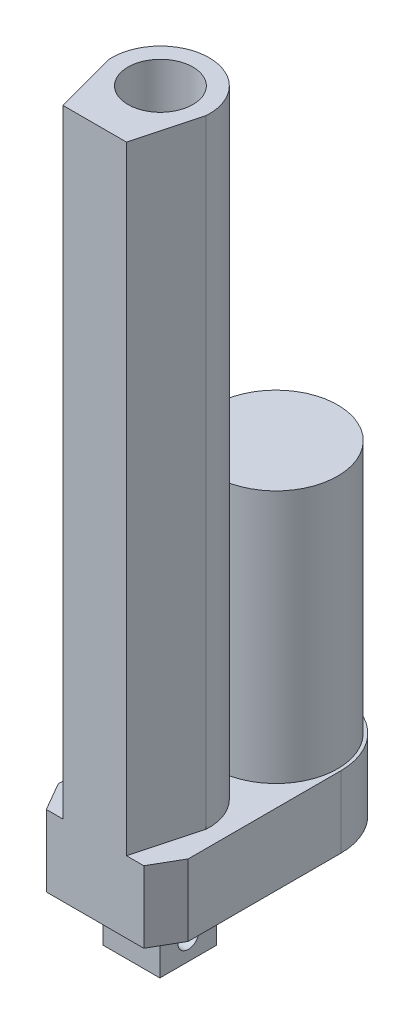
ISO-10303-21;
HEADER;
FILE_DESCRIPTION(('STEP AP214'),'2;1');
FILE_NAME('part.step','',(''),(''),'','','');
FILE_SCHEMA(('AUTOMOTIVE_DESIGN { 1 0 10303 214 1 1 1 1 }'));
ENDSEC;
DATA;
#1=APPLICATION_CONTEXT('core data for automotive mechanical design processes');
#2=APPLICATION_PROTOCOL_DEFINITION('international standard','automotive_design',2000,#1);
#3=PRODUCT_CONTEXT('',#1,'mechanical');
#4=PRODUCT('Part','Part','',(#3));
#5=PRODUCT_RELATED_PRODUCT_CATEGORY('part','',(#4));
#6=PRODUCT_DEFINITION_FORMATION('','',#4);
#7=PRODUCT_DEFINITION_CONTEXT('part definition',#1,'design');
#8=PRODUCT_DEFINITION('design','',#6,#7);
#9=PRODUCT_DEFINITION_SHAPE('','',#8);
#10=(LENGTH_UNIT() NAMED_UNIT(*) SI_UNIT(.MILLI.,.METRE.));
#11=(NAMED_UNIT(*) PLANE_ANGLE_UNIT() SI_UNIT($,.RADIAN.));
#12=(NAMED_UNIT(*) SI_UNIT($,.STERADIAN.) SOLID_ANGLE_UNIT());
#13=UNCERTAINTY_MEASURE_WITH_UNIT(LENGTH_MEASURE(1.E-05),#10,'distance_accuracy_value','');
#14=(GEOMETRIC_REPRESENTATION_CONTEXT(3) GLOBAL_UNCERTAINTY_ASSIGNED_CONTEXT((#13)) GLOBAL_UNIT_ASSIGNED_CONTEXT((#10,
#11,#12)) REPRESENTATION_CONTEXT('',''));
#15=CARTESIAN_POINT('',(0.,0.,0.));
#16=DIRECTION('',(0.,0.,1.));
#17=DIRECTION('',(1.,0.,0.));
#18=AXIS2_PLACEMENT_3D('',#15,#16,#17);
#19=CARTESIAN_POINT('',(1.39693295528514,212.2,29.2101852421836));
#20=DIRECTION('',(0.,-1.,0.));
#21=DIRECTION('',(0.,0.,-1.));
#22=AXIS2_PLACEMENT_3D('',#19,#20,#21);
#23=CYLINDRICAL_SURFACE('',#22,10.);
#24=CARTESIAN_POINT('',(1.39693295528514,212.2,29.2101852421836));
#25=DIRECTION('',(0.,1.,0.));
#26=DIRECTION('',(0.,0.,1.));
#27=AXIS2_PLACEMENT_3D('',#24,#25,#26);
#28=CIRCLE('',#27,10.);
#29=CARTESIAN_POINT('',(1.39693295528514,212.2,39.2101852421836));
#30=VERTEX_POINT('',#29);
#31=EDGE_CURVE('E549',#30,#30,#28,.T.);
#32=ORIENTED_EDGE('',*,*,#31,.T.);
#33=EDGE_LOOP('',(#32));
#34=FACE_BOUND('',#33,.T.);
#35=CARTESIAN_POINT('',(1.39693295528514,22.,29.2101852421836));
#36=DIRECTION('',(0.,-1.,0.));
#37=DIRECTION('',(0.,0.,-1.));
#38=AXIS2_PLACEMENT_3D('',#35,#36,#37);
#39=CIRCLE('',#38,10.);
#40=CARTESIAN_POINT('',(1.39693295528514,22.,19.2101852421836));
#41=VERTEX_POINT('',#40);
#42=EDGE_CURVE('E583',#41,#41,#39,.T.);
#43=ORIENTED_EDGE('',*,*,#42,.T.);
#44=EDGE_LOOP('',(#43));
#45=FACE_BOUND('',#44,.T.);
#46=ADVANCED_FACE('F137',(#34,#45),#23,.F.);
#47=CARTESIAN_POINT('',(-7.10029052433689,-16.5,20.8825637620671));
#48=DIRECTION('',(-1.,0.,0.));
#49=DIRECTION('',(0.,0.,1.));
#50=AXIS2_PLACEMENT_3D('',#47,#48,#49);
#51=PLANE('',#50);
#52=CARTESIAN_POINT('',(-7.10029052433689,-10.,29.6325637620671));
#53=DIRECTION('',(-1.,0.,0.));
#54=DIRECTION('',(0.,0.,1.));
#55=AXIS2_PLACEMENT_3D('',#52,#53,#54);
#56=CIRCLE('',#55,3.25);
#57=CARTESIAN_POINT('',(-7.10029052433689,-10.,32.8825637620671));
#58=VERTEX_POINT('',#57);
#59=EDGE_CURVE('E496',#58,#58,#56,.T.);
#60=ORIENTED_EDGE('',*,*,#59,.F.);
#61=EDGE_LOOP('',(#60));
#62=FACE_BOUND('',#61,.T.);
#63=DIRECTION('',(0.,0.,1.));
#64=VECTOR('',#63,1.);
#65=CARTESIAN_POINT('',(-7.10029052433689,0.,20.8825637620671));
#66=LINE('',#65,#64);
#67=CARTESIAN_POINT('',(-7.10029052433689,0.,20.8825637620671));
#68=VERTEX_POINT('',#67);
#69=CARTESIAN_POINT('',(-7.10029052433689,0.,38.3825637620671));
#70=VERTEX_POINT('',#69);
#71=EDGE_CURVE('E265',#68,#70,#66,.T.);
#72=ORIENTED_EDGE('',*,*,#71,.F.);
#73=DIRECTION('',(0.,1.,0.));
#74=VECTOR('',#73,1.);
#75=CARTESIAN_POINT('',(-7.10029052433689,-16.5,20.8825637620671));
#76=LINE('',#75,#74);
#77=CARTESIAN_POINT('',(-7.10029052433689,-16.5,20.8825637620671));
#78=VERTEX_POINT('',#77);
#79=EDGE_CURVE('E12',#78,#68,#76,.T.);
#80=ORIENTED_EDGE('',*,*,#79,.F.);
#81=DIRECTION('',(0.,0.,1.));
#82=VECTOR('',#81,1.);
#83=CARTESIAN_POINT('',(-7.10029052433689,-16.5,20.8825637620671));
#84=LINE('',#83,#82);
#85=CARTESIAN_POINT('',(-7.10029052433689,-16.5,38.3825637620671));
#86=VERTEX_POINT('',#85);
#87=EDGE_CURVE('E274',#78,#86,#84,.T.);
#88=ORIENTED_EDGE('',*,*,#87,.T.);
#89=DIRECTION('',(0.,1.,0.));
#90=VECTOR('',#89,1.);
#91=CARTESIAN_POINT('',(-7.10029052433689,-16.5,38.3825637620671));
#92=LINE('',#91,#90);
#93=EDGE_CURVE('E141',#86,#70,#92,.T.);
#94=ORIENTED_EDGE('',*,*,#93,.T.);
#95=EDGE_LOOP('',(#72,#80,#88,#94));
#96=FACE_BOUND('',#95,.T.);
#97=ADVANCED_FACE('F139',(#62,#96),#51,.T.);
#98=CARTESIAN_POINT('',(-7.10029052433689,-16.5,20.8825637620671));
#99=DIRECTION('',(0.,0.,1.));
#100=DIRECTION('',(1.,0.,0.));
#101=AXIS2_PLACEMENT_3D('',#98,#99,#100);
#102=PLANE('',#101);
#103=DIRECTION('',(1.,0.,0.));
#104=VECTOR('',#103,1.);
#105=CARTESIAN_POINT('',(-7.10029052433689,0.,20.8825637620671));
#106=LINE('',#105,#104);
#107=CARTESIAN_POINT('',(10.3997094756631,0.,20.8825637620671));
#108=VERTEX_POINT('',#107);
#109=EDGE_CURVE('E277',#68,#108,#106,.T.);
#110=ORIENTED_EDGE('',*,*,#109,.T.);
#111=DIRECTION('',(0.,1.,0.));
#112=VECTOR('',#111,1.);
#113=CARTESIAN_POINT('',(10.3997094756631,-16.5,20.8825637620671));
#114=LINE('',#113,#112);
#115=CARTESIAN_POINT('',(10.3997094756631,-16.5,20.8825637620671));
#116=VERTEX_POINT('',#115);
#117=EDGE_CURVE('E146',#116,#108,#114,.T.);
#118=ORIENTED_EDGE('',*,*,#117,.F.);
#119=DIRECTION('',(1.,0.,0.));
#120=VECTOR('',#119,1.);
#121=CARTESIAN_POINT('',(-7.10029052433689,-16.5,20.8825637620671));
#122=LINE('',#121,#120);
#123=EDGE_CURVE('E159',#78,#116,#122,.T.);
#124=ORIENTED_EDGE('',*,*,#123,.F.);
#125=ORIENTED_EDGE('',*,*,#79,.T.);
#126=EDGE_LOOP('',(#110,#118,#124,#125));
#127=FACE_BOUND('',#126,.T.);
#128=ADVANCED_FACE('F302',(#127),#102,.F.);
#129=CARTESIAN_POINT('',(10.3997094756631,-16.5,20.8825637620671));
#130=DIRECTION('',(-1.,0.,0.));
#131=DIRECTION('',(0.,0.,1.));
#132=AXIS2_PLACEMENT_3D('',#129,#130,#131);
#133=PLANE('',#132);
#134=CARTESIAN_POINT('',(10.3997094756631,-10.,29.6325637620671));
#135=DIRECTION('',(1.,0.,0.));
#136=DIRECTION('',(0.,0.,-1.));
#137=AXIS2_PLACEMENT_3D('',#134,#135,#136);
#138=CIRCLE('',#137,3.25);
#139=CARTESIAN_POINT('',(10.3997094756631,-10.,26.3825637620671));
#140=VERTEX_POINT('',#139);
#141=EDGE_CURVE('E502',#140,#140,#138,.T.);
#142=ORIENTED_EDGE('',*,*,#141,.F.);
#143=EDGE_LOOP('',(#142));
#144=FACE_BOUND('',#143,.T.);
#145=DIRECTION('',(0.,0.,1.));
#146=VECTOR('',#145,1.);
#147=CARTESIAN_POINT('',(10.3997094756631,0.,20.8825637620671));
#148=LINE('',#147,#146);
#149=CARTESIAN_POINT('',(10.3997094756631,0.,38.3825637620671));
#150=VERTEX_POINT('',#149);
#151=EDGE_CURVE('E285',#108,#150,#148,.T.);
#152=ORIENTED_EDGE('',*,*,#151,.T.);
#153=DIRECTION('',(0.,1.,0.));
#154=VECTOR('',#153,1.);
#155=CARTESIAN_POINT('',(10.3997094756631,-16.5,38.3825637620671));
#156=LINE('',#155,#154);
#157=CARTESIAN_POINT('',(10.3997094756631,-16.5,38.3825637620671));
#158=VERTEX_POINT('',#157);
#159=EDGE_CURVE('E289',#158,#150,#156,.T.);
#160=ORIENTED_EDGE('',*,*,#159,.F.);
#161=DIRECTION('',(0.,0.,1.));
#162=VECTOR('',#161,1.);
#163=CARTESIAN_POINT('',(10.3997094756631,-16.5,20.8825637620671));
#164=LINE('',#163,#162);
#165=EDGE_CURVE('E280',#116,#158,#164,.T.);
#166=ORIENTED_EDGE('',*,*,#165,.F.);
#167=ORIENTED_EDGE('',*,*,#117,.T.);
#168=EDGE_LOOP('',(#152,#160,#166,#167));
#169=FACE_BOUND('',#168,.T.);
#170=ADVANCED_FACE('F306',(#144,#169),#133,.F.);
#171=CARTESIAN_POINT('',(-7.10029052433689,-16.5,38.3825637620671));
#172=DIRECTION('',(0.,0.,1.));
#173=DIRECTION('',(1.,0.,0.));
#174=AXIS2_PLACEMENT_3D('',#171,#172,#173);
#175=PLANE('',#174);
#176=DIRECTION('',(1.,0.,0.));
#177=VECTOR('',#176,1.);
#178=CARTESIAN_POINT('',(-7.10029052433689,0.,38.3825637620671));
#179=LINE('',#178,#177);
#180=EDGE_CURVE('E268',#70,#150,#179,.T.);
#181=ORIENTED_EDGE('',*,*,#180,.F.);
#182=ORIENTED_EDGE('',*,*,#93,.F.);
#183=DIRECTION('',(1.,0.,0.));
#184=VECTOR('',#183,1.);
#185=CARTESIAN_POINT('',(-7.10029052433689,-16.5,38.3825637620671));
#186=LINE('',#185,#184);
#187=EDGE_CURVE('E276',#86,#158,#186,.T.);
#188=ORIENTED_EDGE('',*,*,#187,.T.);
#189=ORIENTED_EDGE('',*,*,#159,.T.);
#190=EDGE_LOOP('',(#181,#182,#188,#189));
#191=FACE_BOUND('',#190,.T.);
#192=ADVANCED_FACE('F296',(#191),#175,.T.);
#193=CARTESIAN_POINT('',(0.,-16.5,0.));
#194=DIRECTION('',(0.,1.,0.));
#195=DIRECTION('',(0.,0.,1.));
#196=AXIS2_PLACEMENT_3D('',#193,#194,#195);
#197=PLANE('',#196);
#198=ORIENTED_EDGE('',*,*,#87,.F.);
#199=ORIENTED_EDGE('',*,*,#123,.T.);
#200=ORIENTED_EDGE('',*,*,#165,.T.);
#201=ORIENTED_EDGE('',*,*,#187,.F.);
#202=EDGE_LOOP('',(#198,#199,#200,#201));
#203=FACE_BOUND('',#202,.T.);
#204=ADVANCED_FACE('F304',(#203),#197,.F.);
#205=CARTESIAN_POINT('',(0.,0.,0.));
#206=DIRECTION('',(0.,1.,0.));
#207=DIRECTION('',(0.,0.,1.));
#208=AXIS2_PLACEMENT_3D('',#205,#206,#207);
#209=PLANE('',#208);
#210=ORIENTED_EDGE('',*,*,#71,.T.);
#211=ORIENTED_EDGE('',*,*,#180,.T.);
#212=ORIENTED_EDGE('',*,*,#151,.F.);
#213=ORIENTED_EDGE('',*,*,#109,.F.);
#214=EDGE_LOOP('',(#210,#211,#212,#213));
#215=FACE_BOUND('',#214,.T.);
#216=DIRECTION('',(-0.499999999999998,0.,0.86602540378444));
#217=VECTOR('',#216,1.);
#218=CARTESIAN_POINT('',(33.7854353399476,0.,19.5060301882074));
#219=LINE('',#218,#217);
#220=CARTESIAN_POINT('',(21.5081005950559,0.,40.7709977478905));
#221=VERTEX_POINT('',#220);
#222=CARTESIAN_POINT('',(16.508100595056,0.,49.4312517857349));
#223=VERTEX_POINT('',#222);
#224=EDGE_CURVE('E495',#221,#223,#219,.T.);
#225=ORIENTED_EDGE('',*,*,#224,.T.);
#226=DIRECTION('',(-1.,0.,0.));
#227=VECTOR('',#226,1.);
#228=CARTESIAN_POINT('',(0.,0.,49.4312517857349));
#229=LINE('',#228,#227);
#230=CARTESIAN_POINT('',(-13.4918994049441,0.,49.4312517857349));
#231=VERTEX_POINT('',#230);
#232=EDGE_CURVE('E548',#223,#231,#229,.T.);
#233=ORIENTED_EDGE('',*,*,#232,.T.);
#234=DIRECTION('',(0.5,0.,0.866025403784439));
#235=VECTOR('',#234,1.);
#236=CARTESIAN_POINT('',(-31.5232844473637,0.,18.1999767614266));
#237=LINE('',#236,#235);
#238=CARTESIAN_POINT('',(-18.4918994049441,0.,40.7709977478905));
#239=VERTEX_POINT('',#238);
#240=EDGE_CURVE('E251',#239,#231,#237,.T.);
#241=ORIENTED_EDGE('',*,*,#240,.F.);
#242=DIRECTION('',(0.,0.,1.));
#243=VECTOR('',#242,1.);
#244=CARTESIAN_POINT('',(-18.4918994049441,0.,0.));
#245=LINE('',#244,#243);
#246=CARTESIAN_POINT('',(-18.4918994049441,0.,-6.22900225210949));
#247=VERTEX_POINT('',#246);
#248=EDGE_CURVE('E530',#247,#239,#245,.T.);
#249=ORIENTED_EDGE('',*,*,#248,.F.);
#250=CARTESIAN_POINT('',(1.50810059505592,0.,-6.2290022521095));
#251=DIRECTION('',(0.,1.,0.));
#252=DIRECTION('',(0.,0.,1.));
#253=AXIS2_PLACEMENT_3D('',#250,#251,#252);
#254=CIRCLE('',#253,20.);
#255=CARTESIAN_POINT('',(21.5081005950559,0.,-6.2290022521095));
#256=VERTEX_POINT('',#255);
#257=EDGE_CURVE('E527',#247,#256,#254,.F.);
#258=ORIENTED_EDGE('',*,*,#257,.T.);
#259=DIRECTION('',(0.,0.,-1.));
#260=VECTOR('',#259,1.);
#261=CARTESIAN_POINT('',(21.5081005950559,0.,0.));
#262=LINE('',#261,#260);
#263=EDGE_CURVE('E499',#221,#256,#262,.T.);
#264=ORIENTED_EDGE('',*,*,#263,.F.);
#265=EDGE_LOOP('',(#225,#233,#241,#249,#258,#264));
#266=FACE_BOUND('',#265,.T.);
#267=ADVANCED_FACE('F299',(#215,#266),#209,.F.);
#268=CARTESIAN_POINT('',(22.7960664699933,212.2,6.10818760124099));
#269=DIRECTION('',(-0.965925826289067,0.,-0.258819045102525));
#270=DIRECTION('',(-0.258819045102525,0.,0.965925826289067));
#271=AXIS2_PLACEMENT_3D('',#268,#269,#270);
#272=PLANE('',#271);
#273=DIRECTION('',(0.,-1.,0.));
#274=VECTOR('',#273,1.);
#275=CARTESIAN_POINT('',(11.1876864081163,212.2,49.4312517857349));
#276=LINE('',#275,#274);
#277=CARTESIAN_POINT('',(11.1876864081163,212.2,49.4312517857349));
#278=VERTEX_POINT('',#277);
#279=CARTESIAN_POINT('',(11.1876864081163,22.,49.4312517857349));
#280=VERTEX_POINT('',#279);
#281=EDGE_CURVE('E259',#278,#280,#276,.T.);
#282=ORIENTED_EDGE('',*,*,#281,.T.);
#283=DIRECTION('',(0.258819045102525,0.,-0.965925826289067));
#284=VECTOR('',#283,1.);
#285=CARTESIAN_POINT('',(22.7960664699933,22.,6.10818760124099));
#286=LINE('',#285,#284);
#287=CARTESIAN_POINT('',(16.3713739329175,22.,30.0854665726159));
#288=VERTEX_POINT('',#287);
#289=EDGE_CURVE('E244',#280,#288,#286,.T.);
#290=ORIENTED_EDGE('',*,*,#289,.T.);
#291=DIRECTION('',(0.,-1.,0.));
#292=VECTOR('',#291,1.);
#293=CARTESIAN_POINT('',(16.3713739329175,212.2,30.0854665726159));
#294=LINE('',#293,#292);
#295=CARTESIAN_POINT('',(16.3713739329175,212.2,30.0854665726159));
#296=VERTEX_POINT('',#295);
#297=EDGE_CURVE('E258',#296,#288,#294,.T.);
#298=ORIENTED_EDGE('',*,*,#297,.F.);
#299=DIRECTION('',(0.258819045102525,0.,-0.965925826289067));
#300=VECTOR('',#299,1.);
#301=CARTESIAN_POINT('',(22.7960664699933,212.2,6.10818760124099));
#302=LINE('',#301,#300);
#303=EDGE_CURVE('E551',#278,#296,#302,.T.);
#304=ORIENTED_EDGE('',*,*,#303,.F.);
#305=EDGE_LOOP('',(#282,#290,#298,#304));
#306=FACE_BOUND('',#305,.T.);
#307=ADVANCED_FACE('F256',(#306),#272,.F.);
#308=CARTESIAN_POINT('',(1.39693295528514,212.2,29.2101852421836));
#309=DIRECTION('',(0.,-1.,0.));
#310=DIRECTION('',(0.,0.,-1.));
#311=AXIS2_PLACEMENT_3D('',#308,#309,#310);
#312=CYLINDRICAL_SURFACE('',#311,15.);
#313=ORIENTED_EDGE('',*,*,#297,.T.);
#314=CARTESIAN_POINT('',(1.39693295528514,22.,29.2101852421836));
#315=DIRECTION('',(0.,1.,0.));
#316=DIRECTION('',(0.,0.,1.));
#317=AXIS2_PLACEMENT_3D('',#314,#315,#316);
#318=CIRCLE('',#317,15.);
#319=CARTESIAN_POINT('',(-13.5775080223473,22.,30.0854665726159));
#320=VERTEX_POINT('',#319);
#321=EDGE_CURVE('E239',#288,#320,#318,.T.);
#322=ORIENTED_EDGE('',*,*,#321,.T.);
#323=DIRECTION('',(0.,-1.,0.));
#324=VECTOR('',#323,1.);
#325=CARTESIAN_POINT('',(-13.5775080223473,212.2,30.0854665726159));
#326=LINE('',#325,#324);
#327=CARTESIAN_POINT('',(-13.5775080223473,212.2,30.0854665726159));
#328=VERTEX_POINT('',#327);
#329=EDGE_CURVE('E266',#328,#320,#326,.T.);
#330=ORIENTED_EDGE('',*,*,#329,.F.);
#331=CARTESIAN_POINT('',(1.39693295528514,212.2,29.2101852421836));
#332=DIRECTION('',(0.,1.,0.));
#333=DIRECTION('',(0.,0.,1.));
#334=AXIS2_PLACEMENT_3D('',#331,#332,#333);
#335=CIRCLE('',#334,15.);
#336=EDGE_CURVE('E263',#296,#328,#335,.T.);
#337=ORIENTED_EDGE('',*,*,#336,.F.);
#338=EDGE_LOOP('',(#313,#322,#330,#337));
#339=FACE_BOUND('',#338,.T.);
#340=ADVANCED_FACE('F262',(#339),#312,.T.);
#341=CARTESIAN_POINT('',(-20.1893540880476,212.2,5.40972112359842));
#342=DIRECTION('',(0.965925826289067,0.,-0.258819045102525));
#343=DIRECTION('',(-0.258819045102525,0.,-0.965925826289067));
#344=AXIS2_PLACEMENT_3D('',#341,#342,#343);
#345=PLANE('',#344);
#346=ORIENTED_EDGE('',*,*,#329,.T.);
#347=DIRECTION('',(0.258819045102525,0.,0.965925826289067));
#348=VECTOR('',#347,1.);
#349=CARTESIAN_POINT('',(-20.1893540880476,22.,5.40972112359842));
#350=LINE('',#349,#348);
#351=CARTESIAN_POINT('',(-8.39382049754599,22.,49.4312517857349));
#352=VERTEX_POINT('',#351);
#353=EDGE_CURVE('E246',#320,#352,#350,.T.);
#354=ORIENTED_EDGE('',*,*,#353,.T.);
#355=DIRECTION('',(0.,-1.,0.));
#356=VECTOR('',#355,1.);
#357=CARTESIAN_POINT('',(-8.39382049754599,212.2,49.4312517857349));
#358=LINE('',#357,#356);
#359=CARTESIAN_POINT('',(-8.39382049754599,212.2,49.4312517857349));
#360=VERTEX_POINT('',#359);
#361=EDGE_CURVE('E270',#360,#352,#358,.T.);
#362=ORIENTED_EDGE('',*,*,#361,.F.);
#363=DIRECTION('',(0.258819045102525,0.,0.965925826289067));
#364=VECTOR('',#363,1.);
#365=CARTESIAN_POINT('',(-20.1893540880476,212.2,5.40972112359842));
#366=LINE('',#365,#364);
#367=EDGE_CURVE('E554',#328,#360,#366,.T.);
#368=ORIENTED_EDGE('',*,*,#367,.F.);
#369=EDGE_LOOP('',(#346,#354,#362,#368));
#370=FACE_BOUND('',#369,.T.);
#371=ADVANCED_FACE('F347',(#370),#345,.F.);
#372=CARTESIAN_POINT('',(0.,212.2,49.4312517857349));
#373=DIRECTION('',(0.,0.,1.));
#374=DIRECTION('',(1.,0.,0.));
#375=AXIS2_PLACEMENT_3D('',#372,#373,#374);
#376=PLANE('',#375);
#377=DIRECTION('',(-1.,0.,0.));
#378=VECTOR('',#377,1.);
#379=CARTESIAN_POINT('',(0.,22.,49.4312517857349));
#380=LINE('',#379,#378);
#381=CARTESIAN_POINT('',(16.508100595056,22.,49.4312517857349));
#382=VERTEX_POINT('',#381);
#383=EDGE_CURVE('E260',#382,#280,#380,.T.);
#384=ORIENTED_EDGE('',*,*,#383,.T.);
#385=ORIENTED_EDGE('',*,*,#281,.F.);
#386=DIRECTION('',(-1.,0.,0.));
#387=VECTOR('',#386,1.);
#388=CARTESIAN_POINT('',(0.,212.2,49.4312517857349));
#389=LINE('',#388,#387);
#390=EDGE_CURVE('E556',#278,#360,#389,.T.);
#391=ORIENTED_EDGE('',*,*,#390,.T.);
#392=ORIENTED_EDGE('',*,*,#361,.T.);
#393=CARTESIAN_POINT('',(-13.4918994049441,22.,49.4312517857349));
#394=VERTEX_POINT('',#393);
#395=EDGE_CURVE('E508',#352,#394,#380,.T.);
#396=ORIENTED_EDGE('',*,*,#395,.T.);
#397=DIRECTION('',(0.,-1.,0.));
#398=VECTOR('',#397,1.);
#399=CARTESIAN_POINT('',(-13.4918994049441,22.,49.4312517857349));
#400=LINE('',#399,#398);
#401=EDGE_CURVE('E523',#394,#231,#400,.T.);
#402=ORIENTED_EDGE('',*,*,#401,.T.);
#403=ORIENTED_EDGE('',*,*,#232,.F.);
#404=DIRECTION('',(0.,-1.,0.));
#405=VECTOR('',#404,1.);
#406=CARTESIAN_POINT('',(16.508100595056,22.,49.4312517857349));
#407=LINE('',#406,#405);
#408=EDGE_CURVE('E545',#382,#223,#407,.T.);
#409=ORIENTED_EDGE('',*,*,#408,.F.);
#410=EDGE_LOOP('',(#384,#385,#391,#392,#396,#402,#403,#409));
#411=FACE_BOUND('',#410,.T.);
#412=ADVANCED_FACE('F344',(#411),#376,.T.);
#413=CARTESIAN_POINT('',(0.,212.2,0.));
#414=DIRECTION('',(0.,1.,0.));
#415=DIRECTION('',(0.,0.,1.));
#416=AXIS2_PLACEMENT_3D('',#413,#414,#415);
#417=PLANE('',#416);
#418=ORIENTED_EDGE('',*,*,#31,.F.);
#419=EDGE_LOOP('',(#418));
#420=FACE_BOUND('',#419,.T.);
#421=ORIENTED_EDGE('',*,*,#303,.T.);
#422=ORIENTED_EDGE('',*,*,#336,.T.);
#423=ORIENTED_EDGE('',*,*,#367,.T.);
#424=ORIENTED_EDGE('',*,*,#390,.F.);
#425=EDGE_LOOP('',(#421,#422,#423,#424));
#426=FACE_BOUND('',#425,.T.);
#427=ADVANCED_FACE('F342',(#420,#426),#417,.T.);
#428=CARTESIAN_POINT('',(33.7854353399476,22.,19.5060301882074));
#429=DIRECTION('',(0.86602540378444,0.,0.499999999999998));
#430=DIRECTION('',(0.499999999999998,0.,-0.86602540378444));
#431=AXIS2_PLACEMENT_3D('',#428,#429,#430);
#432=PLANE('',#431);
#433=ORIENTED_EDGE('',*,*,#224,.F.);
#434=DIRECTION('',(0.,-1.,0.));
#435=VECTOR('',#434,1.);
#436=CARTESIAN_POINT('',(21.5081005950559,22.,40.7709977478905));
#437=LINE('',#436,#435);
#438=CARTESIAN_POINT('',(21.5081005950559,22.,40.7709977478905));
#439=VERTEX_POINT('',#438);
#440=EDGE_CURVE('E543',#439,#221,#437,.T.);
#441=ORIENTED_EDGE('',*,*,#440,.F.);
#442=DIRECTION('',(-0.499999999999998,0.,0.86602540378444));
#443=VECTOR('',#442,1.);
#444=CARTESIAN_POINT('',(33.7854353399476,22.,19.5060301882074));
#445=LINE('',#444,#443);
#446=EDGE_CURVE('E507',#439,#382,#445,.T.);
#447=ORIENTED_EDGE('',*,*,#446,.T.);
#448=ORIENTED_EDGE('',*,*,#408,.T.);
#449=EDGE_LOOP('',(#433,#441,#447,#448));
#450=FACE_BOUND('',#449,.T.);
#451=ADVANCED_FACE('F418',(#450),#432,.T.);
#452=CARTESIAN_POINT('',(21.5081005950559,22.,0.));
#453=DIRECTION('',(-1.,0.,0.));
#454=DIRECTION('',(0.,0.,1.));
#455=AXIS2_PLACEMENT_3D('',#452,#453,#454);
#456=PLANE('',#455);
#457=ORIENTED_EDGE('',*,*,#263,.T.);
#458=DIRECTION('',(0.,-1.,0.));
#459=VECTOR('',#458,1.);
#460=CARTESIAN_POINT('',(21.5081005950559,22.,-6.2290022521095));
#461=LINE('',#460,#459);
#462=CARTESIAN_POINT('',(21.5081005950559,22.,-6.2290022521095));
#463=VERTEX_POINT('',#462);
#464=EDGE_CURVE('E541',#463,#256,#461,.T.);
#465=ORIENTED_EDGE('',*,*,#464,.F.);
#466=DIRECTION('',(0.,0.,-1.));
#467=VECTOR('',#466,1.);
#468=CARTESIAN_POINT('',(21.5081005950559,22.,0.));
#469=LINE('',#468,#467);
#470=EDGE_CURVE('E511',#439,#463,#469,.T.);
#471=ORIENTED_EDGE('',*,*,#470,.F.);
#472=ORIENTED_EDGE('',*,*,#440,.T.);
#473=EDGE_LOOP('',(#457,#465,#471,#472));
#474=FACE_BOUND('',#473,.T.);
#475=ADVANCED_FACE('F429',(#474),#456,.F.);
#476=CARTESIAN_POINT('',(1.50810059505592,22.,-6.2290022521095));
#477=DIRECTION('',(0.,-1.,0.));
#478=DIRECTION('',(0.,0.,-1.));
#479=AXIS2_PLACEMENT_3D('',#476,#477,#478);
#480=CYLINDRICAL_SURFACE('',#479,20.);
#481=ORIENTED_EDGE('',*,*,#257,.F.);
#482=DIRECTION('',(0.,-1.,0.));
#483=VECTOR('',#482,1.);
#484=CARTESIAN_POINT('',(-18.4918994049441,22.,-6.22900225210949));
#485=LINE('',#484,#483);
#486=CARTESIAN_POINT('',(-18.4918994049441,22.,-6.22900225210949));
#487=VERTEX_POINT('',#486);
#488=EDGE_CURVE('E539',#487,#247,#485,.T.);
#489=ORIENTED_EDGE('',*,*,#488,.F.);
#490=CARTESIAN_POINT('',(1.50810059505592,22.,-6.2290022521095));
#491=DIRECTION('',(0.,1.,0.));
#492=DIRECTION('',(0.,0.,1.));
#493=AXIS2_PLACEMENT_3D('',#490,#491,#492);
#494=CIRCLE('',#493,20.);
#495=EDGE_CURVE('E513',#487,#463,#494,.F.);
#496=ORIENTED_EDGE('',*,*,#495,.T.);
#497=ORIENTED_EDGE('',*,*,#464,.T.);
#498=EDGE_LOOP('',(#481,#489,#496,#497));
#499=FACE_BOUND('',#498,.T.);
#500=ADVANCED_FACE('F436',(#499),#480,.T.);
#501=CARTESIAN_POINT('',(-18.4918994049441,22.,0.));
#502=DIRECTION('',(1.,0.,0.));
#503=DIRECTION('',(0.,0.,-1.));
#504=AXIS2_PLACEMENT_3D('',#501,#502,#503);
#505=PLANE('',#504);
#506=ORIENTED_EDGE('',*,*,#248,.T.);
#507=DIRECTION('',(0.,-1.,0.));
#508=VECTOR('',#507,1.);
#509=CARTESIAN_POINT('',(-18.4918994049441,22.,40.7709977478905));
#510=LINE('',#509,#508);
#511=CARTESIAN_POINT('',(-18.4918994049441,22.,40.7709977478905));
#512=VERTEX_POINT('',#511);
#513=EDGE_CURVE('E536',#512,#239,#510,.T.);
#514=ORIENTED_EDGE('',*,*,#513,.F.);
#515=DIRECTION('',(0.,0.,1.));
#516=VECTOR('',#515,1.);
#517=CARTESIAN_POINT('',(-18.4918994049441,22.,0.));
#518=LINE('',#517,#516);
#519=EDGE_CURVE('E516',#487,#512,#518,.T.);
#520=ORIENTED_EDGE('',*,*,#519,.F.);
#521=ORIENTED_EDGE('',*,*,#488,.T.);
#522=EDGE_LOOP('',(#506,#514,#520,#521));
#523=FACE_BOUND('',#522,.T.);
#524=ADVANCED_FACE('F444',(#523),#505,.F.);
#525=CARTESIAN_POINT('',(-31.5232844473637,22.,18.1999767614266));
#526=DIRECTION('',(0.866025403784439,0.,-0.5));
#527=DIRECTION('',(-0.5,0.,-0.866025403784439));
#528=AXIS2_PLACEMENT_3D('',#525,#526,#527);
#529=PLANE('',#528);
#530=ORIENTED_EDGE('',*,*,#240,.T.);
#531=ORIENTED_EDGE('',*,*,#401,.F.);
#532=DIRECTION('',(0.5,0.,0.866025403784439));
#533=VECTOR('',#532,1.);
#534=CARTESIAN_POINT('',(-31.5232844473637,22.,18.1999767614266));
#535=LINE('',#534,#533);
#536=EDGE_CURVE('E518',#512,#394,#535,.T.);
#537=ORIENTED_EDGE('',*,*,#536,.F.);
#538=ORIENTED_EDGE('',*,*,#513,.T.);
#539=EDGE_LOOP('',(#530,#531,#537,#538));
#540=FACE_BOUND('',#539,.T.);
#541=ADVANCED_FACE('F374',(#540),#529,.F.);
#542=CARTESIAN_POINT('',(0.,22.,0.));
#543=DIRECTION('',(0.,1.,0.));
#544=DIRECTION('',(0.,0.,1.));
#545=AXIS2_PLACEMENT_3D('',#542,#543,#544);
#546=PLANE('',#545);
#547=CARTESIAN_POINT('',(1.50810059505592,22.,-6.2290022521095));
#548=DIRECTION('',(0.,1.,0.));
#549=DIRECTION('',(0.,0.,1.));
#550=AXIS2_PLACEMENT_3D('',#547,#548,#549);
#551=CIRCLE('',#550,19.);
#552=CARTESIAN_POINT('',(1.50810059505592,22.,12.7709977478905));
#553=VERTEX_POINT('',#552);
#554=EDGE_CURVE('E521',#553,#553,#551,.T.);
#555=ORIENTED_EDGE('',*,*,#554,.F.);
#556=EDGE_LOOP('',(#555));
#557=FACE_BOUND('',#556,.T.);
#558=ORIENTED_EDGE('',*,*,#395,.F.);
#559=ORIENTED_EDGE('',*,*,#353,.F.);
#560=ORIENTED_EDGE('',*,*,#321,.F.);
#561=ORIENTED_EDGE('',*,*,#289,.F.);
#562=ORIENTED_EDGE('',*,*,#383,.F.);
#563=ORIENTED_EDGE('',*,*,#446,.F.);
#564=ORIENTED_EDGE('',*,*,#470,.T.);
#565=ORIENTED_EDGE('',*,*,#495,.F.);
#566=ORIENTED_EDGE('',*,*,#519,.T.);
#567=ORIENTED_EDGE('',*,*,#536,.T.);
#568=EDGE_LOOP('',(#558,#559,#560,#561,#562,#563,#564,#565,#566,#567));
#569=FACE_BOUND('',#568,.T.);
#570=ADVANCED_FACE('F242',(#557,#569),#546,.T.);
#571=CARTESIAN_POINT('',(1.50810059505592,100.,-6.2290022521095));
#572=DIRECTION('',(0.,-1.,0.));
#573=DIRECTION('',(0.,0.,-1.));
#574=AXIS2_PLACEMENT_3D('',#571,#572,#573);
#575=CYLINDRICAL_SURFACE('',#574,19.);
#576=ORIENTED_EDGE('',*,*,#554,.T.);
#577=EDGE_LOOP('',(#576));
#578=FACE_BOUND('',#577,.T.);
#579=CARTESIAN_POINT('',(1.50810059505592,100.,-6.2290022521095));
#580=DIRECTION('',(0.,1.,0.));
#581=DIRECTION('',(0.,0.,1.));
#582=AXIS2_PLACEMENT_3D('',#579,#580,#581);
#583=CIRCLE('',#582,19.);
#584=CARTESIAN_POINT('',(1.50810059505592,100.,12.7709977478905));
#585=VERTEX_POINT('',#584);
#586=EDGE_CURVE('E493',#585,#585,#583,.T.);
#587=ORIENTED_EDGE('',*,*,#586,.F.);
#588=EDGE_LOOP('',(#587));
#589=FACE_BOUND('',#588,.T.);
#590=ADVANCED_FACE('F373',(#578,#589),#575,.T.);
#591=CARTESIAN_POINT('',(0.,100.,0.));
#592=DIRECTION('',(0.,1.,0.));
#593=DIRECTION('',(0.,0.,1.));
#594=AXIS2_PLACEMENT_3D('',#591,#592,#593);
#595=PLANE('',#594);
#596=ORIENTED_EDGE('',*,*,#586,.T.);
#597=EDGE_LOOP('',(#596));
#598=FACE_BOUND('',#597,.T.);
#599=ADVANCED_FACE('F383',(#598),#595,.T.);
#600=CARTESIAN_POINT('',(-8.60029052433688,-10.,29.6325637620671));
#601=DIRECTION('',(1.,0.,0.));
#602=DIRECTION('',(0.,0.,-1.));
#603=AXIS2_PLACEMENT_3D('',#600,#601,#602);
#604=CYLINDRICAL_SURFACE('',#603,3.25);
#605=ORIENTED_EDGE('',*,*,#59,.T.);
#606=EDGE_LOOP('',(#605));
#607=FACE_BOUND('',#606,.T.);
#608=ORIENTED_EDGE('',*,*,#141,.T.);
#609=EDGE_LOOP('',(#608));
#610=FACE_BOUND('',#609,.T.);
#611=ADVANCED_FACE('F393',(#607,#610),#604,.F.);
#612=CARTESIAN_POINT('',(-13.4918994049441,22.,-3.5687482142651));
#613=DIRECTION('',(0.,-1.,0.));
#614=DIRECTION('',(0.,0.,-1.));
#615=AXIS2_PLACEMENT_3D('',#612,#613,#614);
#616=PLANE('',#615);
#617=ORIENTED_EDGE('',*,*,#42,.F.);
#618=EDGE_LOOP('',(#617));
#619=FACE_BOUND('',#618,.T.);
#620=ADVANCED_FACE('F390',(#619),#616,.F.);
#621=CLOSED_SHELL('',(#46,#97,#128,#170,#192,#204,#267,#307,#340,#371,#412,#427,#451,#475,#500,
#524,#541,#570,#590,#599,#611,#620));
#622=MANIFOLD_SOLID_BREP('B2',#621);
#623=ADVANCED_BREP_SHAPE_REPRESENTATION('',(#18,#622),#14);
#624=SHAPE_DEFINITION_REPRESENTATION(#9,#623);
ENDSEC;
END-ISO-10303-21;
